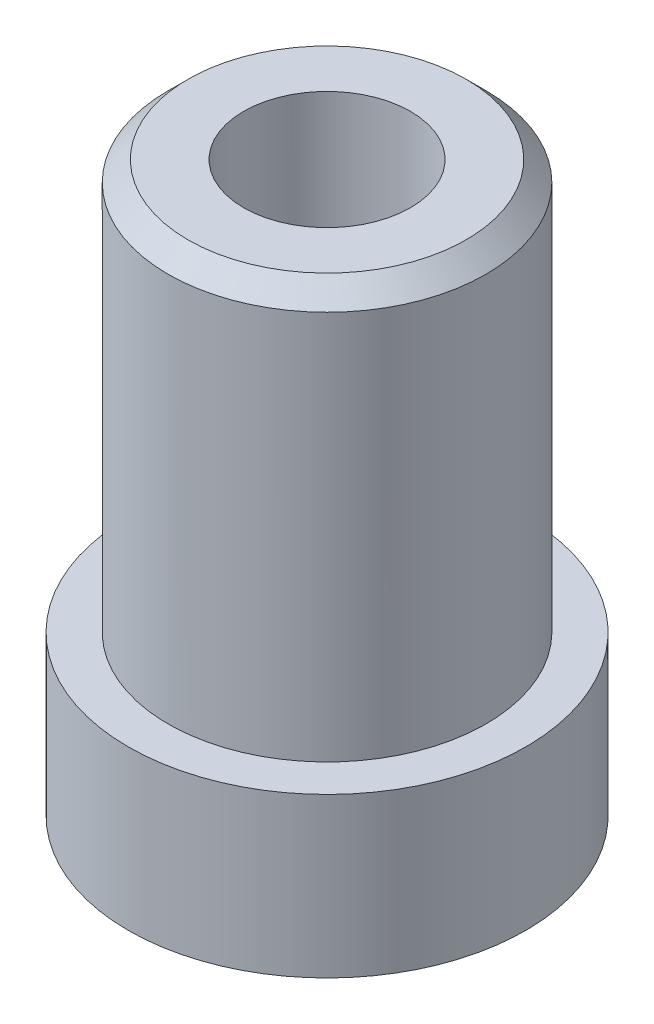
ISO-10303-21;
HEADER;
FILE_DESCRIPTION(('STEP AP214'),'2;1');
FILE_NAME('part.step','',(''),(''),'','','');
FILE_SCHEMA(('AUTOMOTIVE_DESIGN { 1 0 10303 214 1 1 1 1 }'));
ENDSEC;
DATA;
#1=APPLICATION_CONTEXT('core data for automotive mechanical design processes');
#2=APPLICATION_PROTOCOL_DEFINITION('international standard','automotive_design',2000,#1);
#3=PRODUCT_CONTEXT('',#1,'mechanical');
#4=PRODUCT('Part','Part','',(#3));
#5=PRODUCT_RELATED_PRODUCT_CATEGORY('part','',(#4));
#6=PRODUCT_DEFINITION_FORMATION('','',#4);
#7=PRODUCT_DEFINITION_CONTEXT('part definition',#1,'design');
#8=PRODUCT_DEFINITION('design','',#6,#7);
#9=PRODUCT_DEFINITION_SHAPE('','',#8);
#10=(LENGTH_UNIT() NAMED_UNIT(*) SI_UNIT(.MILLI.,.METRE.));
#11=(NAMED_UNIT(*) PLANE_ANGLE_UNIT() SI_UNIT($,.RADIAN.));
#12=(NAMED_UNIT(*) SI_UNIT($,.STERADIAN.) SOLID_ANGLE_UNIT());
#13=UNCERTAINTY_MEASURE_WITH_UNIT(LENGTH_MEASURE(1.E-05),#10,'distance_accuracy_value','');
#14=(GEOMETRIC_REPRESENTATION_CONTEXT(3) GLOBAL_UNCERTAINTY_ASSIGNED_CONTEXT((#13)) GLOBAL_UNIT_ASSIGNED_CONTEXT((#10,
#11,#12)) REPRESENTATION_CONTEXT('',''));
#15=CARTESIAN_POINT('',(0.,0.,0.));
#16=DIRECTION('',(0.,0.,1.));
#17=DIRECTION('',(1.,0.,0.));
#18=AXIS2_PLACEMENT_3D('',#15,#16,#17);
#19=CARTESIAN_POINT('',(0.,7.15,0.));
#20=DIRECTION('',(0.,-1.,0.));
#21=DIRECTION('',(0.,0.,-1.));
#22=AXIS2_PLACEMENT_3D('',#19,#20,#21);
#23=CYLINDRICAL_SURFACE('',#22,4.);
#24=CARTESIAN_POINT('',(0.,6.65,0.));
#25=DIRECTION('',(0.,1.,0.));
#26=DIRECTION('',(0.,0.,1.));
#27=AXIS2_PLACEMENT_3D('',#24,#25,#26);
#28=CIRCLE('',#27,4.);
#29=CARTESIAN_POINT('',(0.,6.65,4.));
#30=VERTEX_POINT('',#29);
#31=EDGE_CURVE('E10',#30,#30,#28,.F.);
#32=ORIENTED_EDGE('',*,*,#31,.T.);
#33=EDGE_LOOP('',(#32));
#34=FACE_BOUND('',#33,.T.);
#35=CARTESIAN_POINT('',(0.,-3.15,0.));
#36=DIRECTION('',(0.,-1.,0.));
#37=DIRECTION('',(0.,0.,-1.));
#38=AXIS2_PLACEMENT_3D('',#35,#36,#37);
#39=CIRCLE('',#38,4.);
#40=CARTESIAN_POINT('',(0.,-3.15,-4.));
#41=VERTEX_POINT('',#40);
#42=EDGE_CURVE('E45',#41,#41,#39,.T.);
#43=ORIENTED_EDGE('',*,*,#42,.F.);
#44=EDGE_LOOP('',(#43));
#45=FACE_BOUND('',#44,.T.);
#46=ADVANCED_FACE('F34',(#34,#45),#23,.T.);
#47=CARTESIAN_POINT('',(0.,7.15,0.));
#48=DIRECTION('',(0.,1.,0.));
#49=DIRECTION('',(0.,0.,1.));
#50=AXIS2_PLACEMENT_3D('',#47,#48,#49);
#51=PLANE('',#50);
#52=CARTESIAN_POINT('',(0.,7.15,0.));
#53=DIRECTION('',(0.,1.,0.));
#54=DIRECTION('',(0.,0.,1.));
#55=AXIS2_PLACEMENT_3D('',#52,#53,#54);
#56=CIRCLE('',#55,2.09999999999999);
#57=CARTESIAN_POINT('',(0.,7.15,2.09999999999999));
#58=VERTEX_POINT('',#57);
#59=EDGE_CURVE('E57',#58,#58,#56,.T.);
#60=ORIENTED_EDGE('',*,*,#59,.F.);
#61=EDGE_LOOP('',(#60));
#62=FACE_BOUND('',#61,.T.);
#63=CARTESIAN_POINT('',(0.,7.15,0.));
#64=DIRECTION('',(0.,1.,0.));
#65=DIRECTION('',(0.,0.,1.));
#66=AXIS2_PLACEMENT_3D('',#63,#64,#65);
#67=CIRCLE('',#66,3.5);
#68=CARTESIAN_POINT('',(0.,7.15,3.5));
#69=VERTEX_POINT('',#68);
#70=EDGE_CURVE('E41',#69,#69,#67,.T.);
#71=ORIENTED_EDGE('',*,*,#70,.T.);
#72=EDGE_LOOP('',(#71));
#73=FACE_BOUND('',#72,.T.);
#74=ADVANCED_FACE('F75',(#62,#73),#51,.T.);
#75=CARTESIAN_POINT('',(0.,7.15,0.));
#76=DIRECTION('',(0.,1.,0.));
#77=DIRECTION('',(0.,0.,1.));
#78=AXIS2_PLACEMENT_3D('',#75,#76,#77);
#79=CYLINDRICAL_SURFACE('',#78,5.);
#80=CARTESIAN_POINT('',(0.,-3.15,0.));
#81=DIRECTION('',(0.,1.,0.));
#82=DIRECTION('',(0.,0.,1.));
#83=AXIS2_PLACEMENT_3D('',#80,#81,#82);
#84=CIRCLE('',#83,5.);
#85=CARTESIAN_POINT('',(0.,-3.15,5.));
#86=VERTEX_POINT('',#85);
#87=EDGE_CURVE('E54',#86,#86,#84,.T.);
#88=ORIENTED_EDGE('',*,*,#87,.F.);
#89=EDGE_LOOP('',(#88));
#90=FACE_BOUND('',#89,.T.);
#91=CARTESIAN_POINT('',(0.,-7.15,0.));
#92=DIRECTION('',(0.,1.,0.));
#93=DIRECTION('',(0.,0.,1.));
#94=AXIS2_PLACEMENT_3D('',#91,#92,#93);
#95=CIRCLE('',#94,5.);
#96=CARTESIAN_POINT('',(0.,-7.15,5.));
#97=VERTEX_POINT('',#96);
#98=EDGE_CURVE('E49',#97,#97,#95,.T.);
#99=ORIENTED_EDGE('',*,*,#98,.T.);
#100=EDGE_LOOP('',(#99));
#101=FACE_BOUND('',#100,.T.);
#102=ADVANCED_FACE('F73',(#90,#101),#79,.T.);
#103=CARTESIAN_POINT('',(5.,-3.15,0.));
#104=DIRECTION('',(0.,-1.,0.));
#105=DIRECTION('',(0.,0.,-1.));
#106=AXIS2_PLACEMENT_3D('',#103,#104,#105);
#107=PLANE('',#106);
#108=ORIENTED_EDGE('',*,*,#42,.T.);
#109=EDGE_LOOP('',(#108));
#110=FACE_BOUND('',#109,.T.);
#111=ORIENTED_EDGE('',*,*,#87,.T.);
#112=EDGE_LOOP('',(#111));
#113=FACE_BOUND('',#112,.T.);
#114=ADVANCED_FACE('F69',(#110,#113),#107,.F.);
#115=CARTESIAN_POINT('',(0.,-7.15,0.));
#116=DIRECTION('',(0.,1.,0.));
#117=DIRECTION('',(0.,0.,1.));
#118=AXIS2_PLACEMENT_3D('',#115,#116,#117);
#119=PLANE('',#118);
#120=CARTESIAN_POINT('',(0.,-7.15,0.));
#121=DIRECTION('',(0.,-1.,0.));
#122=DIRECTION('',(0.,0.,-1.));
#123=AXIS2_PLACEMENT_3D('',#120,#121,#122);
#124=CIRCLE('',#123,2.09999999999999);
#125=CARTESIAN_POINT('',(0.,-7.15,-2.09999999999999));
#126=VERTEX_POINT('',#125);
#127=EDGE_CURVE('E60',#126,#126,#124,.T.);
#128=ORIENTED_EDGE('',*,*,#127,.F.);
#129=EDGE_LOOP('',(#128));
#130=FACE_BOUND('',#129,.T.);
#131=ORIENTED_EDGE('',*,*,#98,.F.);
#132=EDGE_LOOP('',(#131));
#133=FACE_BOUND('',#132,.T.);
#134=ADVANCED_FACE('F66',(#130,#133),#119,.F.);
#135=CARTESIAN_POINT('',(0.,7.15,0.));
#136=DIRECTION('',(0.,-1.,0.));
#137=DIRECTION('',(0.,0.,-1.));
#138=AXIS2_PLACEMENT_3D('',#135,#136,#137);
#139=CONICAL_SURFACE('',#138,3.5,0.785398163397445);
#140=ORIENTED_EDGE('',*,*,#31,.F.);
#141=EDGE_LOOP('',(#140));
#142=FACE_BOUND('',#141,.T.);
#143=ORIENTED_EDGE('',*,*,#70,.F.);
#144=EDGE_LOOP('',(#143));
#145=FACE_BOUND('',#144,.T.);
#146=ADVANCED_FACE('F36',(#142,#145),#139,.T.);
#147=CARTESIAN_POINT('',(0.,-7.15,0.));
#148=DIRECTION('',(0.,-1.,0.));
#149=DIRECTION('',(0.,0.,-1.));
#150=AXIS2_PLACEMENT_3D('',#147,#148,#149);
#151=CYLINDRICAL_SURFACE('',#150,2.09999999999999);
#152=ORIENTED_EDGE('',*,*,#59,.T.);
#153=EDGE_LOOP('',(#152));
#154=FACE_BOUND('',#153,.T.);
#155=ORIENTED_EDGE('',*,*,#127,.T.);
#156=EDGE_LOOP('',(#155));
#157=FACE_BOUND('',#156,.T.);
#158=ADVANCED_FACE('F64',(#154,#157),#151,.F.);
#159=CLOSED_SHELL('',(#46,#74,#102,#114,#134,#146,#158));
#160=MANIFOLD_SOLID_BREP('B2',#159);
#161=ADVANCED_BREP_SHAPE_REPRESENTATION('',(#18,#160),#14);
#162=SHAPE_DEFINITION_REPRESENTATION(#9,#161);
ENDSEC;
END-ISO-10303-21;
